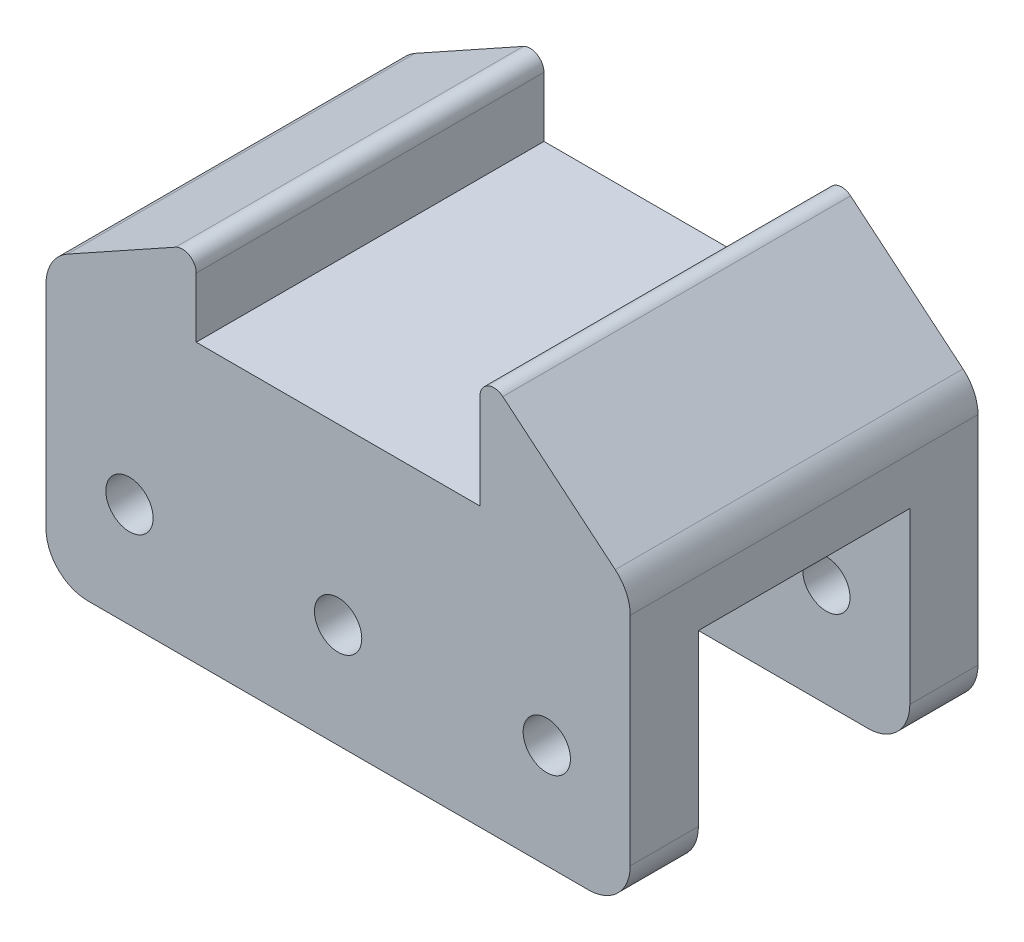
ISO-10303-21;
HEADER;
FILE_DESCRIPTION(('STEP AP214'),'2;1');
FILE_NAME('part.step','',(''),(''),'','','');
FILE_SCHEMA(('AUTOMOTIVE_DESIGN { 1 0 10303 214 1 1 1 1 }'));
ENDSEC;
DATA;
#1=APPLICATION_CONTEXT('core data for automotive mechanical design processes');
#2=APPLICATION_PROTOCOL_DEFINITION('international standard','automotive_design',2000,#1);
#3=PRODUCT_CONTEXT('',#1,'mechanical');
#4=PRODUCT('Part','Part','',(#3));
#5=PRODUCT_RELATED_PRODUCT_CATEGORY('part','',(#4));
#6=PRODUCT_DEFINITION_FORMATION('','',#4);
#7=PRODUCT_DEFINITION_CONTEXT('part definition',#1,'design');
#8=PRODUCT_DEFINITION('design','',#6,#7);
#9=PRODUCT_DEFINITION_SHAPE('','',#8);
#10=(LENGTH_UNIT() NAMED_UNIT(*) SI_UNIT(.MILLI.,.METRE.));
#11=(NAMED_UNIT(*) PLANE_ANGLE_UNIT() SI_UNIT($,.RADIAN.));
#12=(NAMED_UNIT(*) SI_UNIT($,.STERADIAN.) SOLID_ANGLE_UNIT());
#13=UNCERTAINTY_MEASURE_WITH_UNIT(LENGTH_MEASURE(1.E-05),#10,'distance_accuracy_value','');
#14=(GEOMETRIC_REPRESENTATION_CONTEXT(3) GLOBAL_UNCERTAINTY_ASSIGNED_CONTEXT((#13)) GLOBAL_UNIT_ASSIGNED_CONTEXT((#10,
#11,#12)) REPRESENTATION_CONTEXT('',''));
#15=CARTESIAN_POINT('',(0.,0.,0.));
#16=DIRECTION('',(0.,0.,1.));
#17=DIRECTION('',(1.,0.,0.));
#18=AXIS2_PLACEMENT_3D('',#15,#16,#17);
#19=CARTESIAN_POINT('',(0.,20.,0.));
#20=DIRECTION('',(0.,-1.,0.));
#21=DIRECTION('',(0.,0.,-1.));
#22=AXIS2_PLACEMENT_3D('',#19,#20,#21);
#23=PLANE('',#22);
#24=DIRECTION('',(-1.,0.,0.));
#25=VECTOR('',#24,1.);
#26=CARTESIAN_POINT('',(0.,20.,-25.));
#27=LINE('',#26,#25);
#28=CARTESIAN_POINT('',(31.2,20.,-25.));
#29=VERTEX_POINT('',#28);
#30=CARTESIAN_POINT('',(10.8,20.,-25.));
#31=VERTEX_POINT('',#30);
#32=EDGE_CURVE('E187',#29,#31,#27,.T.);
#33=ORIENTED_EDGE('',*,*,#32,.T.);
#34=DIRECTION('',(0.,0.,1.));
#35=VECTOR('',#34,1.);
#36=CARTESIAN_POINT('',(10.8,20.,-39.058449416632));
#37=LINE('',#36,#35);
#38=CARTESIAN_POINT('',(10.8,20.,0.));
#39=VERTEX_POINT('',#38);
#40=EDGE_CURVE('E198',#31,#39,#37,.T.);
#41=ORIENTED_EDGE('',*,*,#40,.T.);
#42=DIRECTION('',(1.,0.,0.));
#43=VECTOR('',#42,1.);
#44=CARTESIAN_POINT('',(0.,20.,0.));
#45=LINE('',#44,#43);
#46=CARTESIAN_POINT('',(31.2,20.,0.));
#47=VERTEX_POINT('',#46);
#48=EDGE_CURVE('E212',#39,#47,#45,.T.);
#49=ORIENTED_EDGE('',*,*,#48,.T.);
#50=DIRECTION('',(0.,0.,1.));
#51=VECTOR('',#50,1.);
#52=CARTESIAN_POINT('',(31.2,20.,-39.058449416632));
#53=LINE('',#52,#51);
#54=EDGE_CURVE('E209',#29,#47,#53,.T.);
#55=ORIENTED_EDGE('',*,*,#54,.F.);
#56=EDGE_LOOP('',(#33,#41,#49,#55));
#57=FACE_BOUND('',#56,.T.);
#58=ADVANCED_FACE('F45',(#57),#23,.F.);
#59=CARTESIAN_POINT('',(0.,0.,0.));
#60=DIRECTION('',(0.,-1.,0.));
#61=DIRECTION('',(0.,0.,-1.));
#62=AXIS2_PLACEMENT_3D('',#59,#60,#61);
#63=PLANE('',#62);
#64=DIRECTION('',(-1.,0.,0.));
#65=VECTOR('',#64,1.);
#66=CARTESIAN_POINT('',(0.,0.,-25.));
#67=LINE('',#66,#65);
#68=CARTESIAN_POINT('',(39.,0.,-25.));
#69=VERTEX_POINT('',#68);
#70=CARTESIAN_POINT('',(3.,0.,-25.));
#71=VERTEX_POINT('',#70);
#72=EDGE_CURVE('E219',#69,#71,#67,.T.);
#73=ORIENTED_EDGE('',*,*,#72,.F.);
#74=DIRECTION('',(0.,0.,-1.));
#75=VECTOR('',#74,1.);
#76=CARTESIAN_POINT('',(39.,0.,-20.1));
#77=LINE('',#76,#75);
#78=CARTESIAN_POINT('',(39.,0.,-20.1));
#79=VERTEX_POINT('',#78);
#80=EDGE_CURVE('E315',#69,#79,#77,.F.);
#81=ORIENTED_EDGE('',*,*,#80,.T.);
#82=DIRECTION('',(-1.,0.,0.));
#83=VECTOR('',#82,1.);
#84=CARTESIAN_POINT('',(42.,0.,-20.1));
#85=LINE('',#84,#83);
#86=CARTESIAN_POINT('',(3.00000000000002,0.,-20.1));
#87=VERTEX_POINT('',#86);
#88=EDGE_CURVE('E390',#79,#87,#85,.T.);
#89=ORIENTED_EDGE('',*,*,#88,.T.);
#90=DIRECTION('',(0.,0.,1.));
#91=VECTOR('',#90,1.);
#92=CARTESIAN_POINT('',(3.,0.,-25.));
#93=LINE('',#92,#91);
#94=EDGE_CURVE('E312',#87,#71,#93,.F.);
#95=ORIENTED_EDGE('',*,*,#94,.T.);
#96=EDGE_LOOP('',(#73,#81,#89,#95));
#97=FACE_BOUND('',#96,.T.);
#98=ADVANCED_FACE('F415',(#97),#63,.T.);
#99=CARTESIAN_POINT('',(0.,20.,0.));
#100=DIRECTION('',(1.,0.,0.));
#101=DIRECTION('',(0.,0.,-1.));
#102=AXIS2_PLACEMENT_3D('',#99,#100,#101);
#103=PLANE('',#102);
#104=DIRECTION('',(0.,-1.,0.));
#105=VECTOR('',#104,1.);
#106=CARTESIAN_POINT('',(0.,20.,0.));
#107=LINE('',#106,#105);
#108=CARTESIAN_POINT('',(0.,18.2347899530043,0.));
#109=VERTEX_POINT('',#108);
#110=CARTESIAN_POINT('',(0.,3.,0.));
#111=VERTEX_POINT('',#110);
#112=EDGE_CURVE('E238',#109,#111,#107,.T.);
#113=ORIENTED_EDGE('',*,*,#112,.F.);
#114=DIRECTION('',(0.,0.,1.));
#115=VECTOR('',#114,1.);
#116=CARTESIAN_POINT('',(0.,18.2347899530043,-25.));
#117=LINE('',#116,#115);
#118=CARTESIAN_POINT('',(0.,18.2347899530043,-25.));
#119=VERTEX_POINT('',#118);
#120=EDGE_CURVE('E309',#109,#119,#117,.F.);
#121=ORIENTED_EDGE('',*,*,#120,.T.);
#122=DIRECTION('',(0.,-1.,0.));
#123=VECTOR('',#122,1.);
#124=CARTESIAN_POINT('',(0.,20.,-25.));
#125=LINE('',#124,#123);
#126=CARTESIAN_POINT('',(0.,3.,-25.));
#127=VERTEX_POINT('',#126);
#128=EDGE_CURVE('E211',#119,#127,#125,.T.);
#129=ORIENTED_EDGE('',*,*,#128,.T.);
#130=DIRECTION('',(0.,0.,1.));
#131=VECTOR('',#130,1.);
#132=CARTESIAN_POINT('',(0.,3.,-20.1));
#133=LINE('',#132,#131);
#134=CARTESIAN_POINT('',(0.,3.,-20.1));
#135=VERTEX_POINT('',#134);
#136=EDGE_CURVE('E305',#127,#135,#133,.T.);
#137=ORIENTED_EDGE('',*,*,#136,.T.);
#138=DIRECTION('',(0.,-1.,0.));
#139=VECTOR('',#138,1.);
#140=CARTESIAN_POINT('',(0.,0.,-20.1));
#141=LINE('',#140,#139);
#142=CARTESIAN_POINT('',(0.,15.2,-20.1));
#143=VERTEX_POINT('',#142);
#144=EDGE_CURVE('E194',#143,#135,#141,.T.);
#145=ORIENTED_EDGE('',*,*,#144,.F.);
#146=DIRECTION('',(0.,0.,-1.));
#147=VECTOR('',#146,1.);
#148=CARTESIAN_POINT('',(0.,15.2,-20.1));
#149=LINE('',#148,#147);
#150=CARTESIAN_POINT('',(0.,15.2,-4.9));
#151=VERTEX_POINT('',#150);
#152=EDGE_CURVE('E383',#151,#143,#149,.T.);
#153=ORIENTED_EDGE('',*,*,#152,.F.);
#154=DIRECTION('',(0.,1.,0.));
#155=VECTOR('',#154,1.);
#156=CARTESIAN_POINT('',(0.,0.,-4.9));
#157=LINE('',#156,#155);
#158=CARTESIAN_POINT('',(0.,3.,-4.9));
#159=VERTEX_POINT('',#158);
#160=EDGE_CURVE('E394',#159,#151,#157,.T.);
#161=ORIENTED_EDGE('',*,*,#160,.F.);
#162=DIRECTION('',(0.,0.,1.));
#163=VECTOR('',#162,1.);
#164=CARTESIAN_POINT('',(0.,3.,0.));
#165=LINE('',#164,#163);
#166=EDGE_CURVE('E301',#159,#111,#165,.T.);
#167=ORIENTED_EDGE('',*,*,#166,.T.);
#168=EDGE_LOOP('',(#113,#121,#129,#137,#145,#153,#161,#167));
#169=FACE_BOUND('',#168,.T.);
#170=ADVANCED_FACE('F427',(#169),#103,.F.);
#171=CARTESIAN_POINT('',(0.,20.,0.));
#172=DIRECTION('',(0.,0.,-1.));
#173=DIRECTION('',(-1.,0.,0.));
#174=AXIS2_PLACEMENT_3D('',#171,#172,#173);
#175=PLANE('',#174);
#176=CARTESIAN_POINT('',(6.,7.5,0.));
#177=DIRECTION('',(0.,0.,1.));
#178=DIRECTION('',(1.,0.,0.));
#179=AXIS2_PLACEMENT_3D('',#176,#177,#178);
#180=CIRCLE('',#179,1.7);
#181=CARTESIAN_POINT('',(7.7,7.5,0.));
#182=VERTEX_POINT('',#181);
#183=EDGE_CURVE('E562',#182,#182,#180,.T.);
#184=ORIENTED_EDGE('',*,*,#183,.F.);
#185=EDGE_LOOP('',(#184));
#186=FACE_BOUND('',#185,.T.);
#187=CARTESIAN_POINT('',(21.,7.5,0.));
#188=DIRECTION('',(0.,0.,1.));
#189=DIRECTION('',(1.,0.,0.));
#190=AXIS2_PLACEMENT_3D('',#187,#188,#189);
#191=CIRCLE('',#190,1.7);
#192=CARTESIAN_POINT('',(22.7,7.5,0.));
#193=VERTEX_POINT('',#192);
#194=EDGE_CURVE('E558',#193,#193,#191,.T.);
#195=ORIENTED_EDGE('',*,*,#194,.F.);
#196=EDGE_LOOP('',(#195));
#197=FACE_BOUND('',#196,.T.);
#198=CARTESIAN_POINT('',(36.,7.5,0.));
#199=DIRECTION('',(0.,0.,1.));
#200=DIRECTION('',(1.,0.,0.));
#201=AXIS2_PLACEMENT_3D('',#198,#199,#200);
#202=CIRCLE('',#201,1.7);
#203=CARTESIAN_POINT('',(37.7,7.5,0.));
#204=VERTEX_POINT('',#203);
#205=EDGE_CURVE('E550',#204,#204,#202,.T.);
#206=ORIENTED_EDGE('',*,*,#205,.F.);
#207=EDGE_LOOP('',(#206));
#208=FACE_BOUND('',#207,.T.);
#209=DIRECTION('',(0.,1.,0.));
#210=VECTOR('',#209,1.);
#211=CARTESIAN_POINT('',(10.8,26.,0.));
#212=LINE('',#211,#210);
#213=CARTESIAN_POINT('',(10.8,24.3004855398903,0.));
#214=VERTEX_POINT('',#213);
#215=EDGE_CURVE('E201',#39,#214,#212,.T.);
#216=ORIENTED_EDGE('',*,*,#215,.T.);
#217=CARTESIAN_POINT('',(9.8,24.3004855398903,0.));
#218=DIRECTION('',(0.,0.,-1.));
#219=DIRECTION('',(-1.,0.,0.));
#220=AXIS2_PLACEMENT_3D('',#217,#218,#219);
#221=CIRCLE('',#220,1.);
#222=CARTESIAN_POINT('',(9.31435706882137,25.1746428160119,0.));
#223=VERTEX_POINT('',#222);
#224=EDGE_CURVE('E342',#214,#223,#221,.F.);
#225=ORIENTED_EDGE('',*,*,#224,.T.);
#226=DIRECTION('',(-0.874157276121538,-0.485642931178632,0.));
#227=VECTOR('',#226,1.);
#228=CARTESIAN_POINT('',(0.,20.,0.));
#229=LINE('',#228,#227);
#230=CARTESIAN_POINT('',(1.5430712064641,20.8572617813689,0.));
#231=VERTEX_POINT('',#230);
#232=EDGE_CURVE('E206',#223,#231,#229,.T.);
#233=ORIENTED_EDGE('',*,*,#232,.T.);
#234=CARTESIAN_POINT('',(3.,18.2347899530043,0.));
#235=DIRECTION('',(0.,0.,-1.));
#236=DIRECTION('',(-1.,0.,0.));
#237=AXIS2_PLACEMENT_3D('',#234,#235,#236);
#238=CIRCLE('',#237,3.);
#239=EDGE_CURVE('E291',#231,#109,#238,.F.);
#240=ORIENTED_EDGE('',*,*,#239,.T.);
#241=ORIENTED_EDGE('',*,*,#112,.T.);
#242=CARTESIAN_POINT('',(3.,3.,0.));
#243=DIRECTION('',(0.,0.,-1.));
#244=DIRECTION('',(-1.,0.,0.));
#245=AXIS2_PLACEMENT_3D('',#242,#243,#244);
#246=CIRCLE('',#245,3.);
#247=CARTESIAN_POINT('',(3.,0.,0.));
#248=VERTEX_POINT('',#247);
#249=EDGE_CURVE('E285',#111,#248,#246,.F.);
#250=ORIENTED_EDGE('',*,*,#249,.T.);
#251=DIRECTION('',(1.,0.,0.));
#252=VECTOR('',#251,1.);
#253=CARTESIAN_POINT('',(0.,0.,0.));
#254=LINE('',#253,#252);
#255=CARTESIAN_POINT('',(39.,0.,0.));
#256=VERTEX_POINT('',#255);
#257=EDGE_CURVE('E223',#248,#256,#254,.T.);
#258=ORIENTED_EDGE('',*,*,#257,.T.);
#259=CARTESIAN_POINT('',(39.,3.,0.));
#260=DIRECTION('',(0.,0.,-1.));
#261=DIRECTION('',(-1.,0.,0.));
#262=AXIS2_PLACEMENT_3D('',#259,#260,#261);
#263=CIRCLE('',#262,3.);
#264=CARTESIAN_POINT('',(42.,3.,0.));
#265=VERTEX_POINT('',#264);
#266=EDGE_CURVE('E288',#256,#265,#263,.F.);
#267=ORIENTED_EDGE('',*,*,#266,.T.);
#268=DIRECTION('',(0.,-1.,0.));
#269=VECTOR('',#268,1.);
#270=CARTESIAN_POINT('',(42.,20.,0.));
#271=LINE('',#270,#269);
#272=CARTESIAN_POINT('',(42.,18.5948751620467,0.));
#273=VERTEX_POINT('',#272);
#274=EDGE_CURVE('E234',#273,#265,#271,.T.);
#275=ORIENTED_EDGE('',*,*,#274,.F.);
#276=CARTESIAN_POINT('',(39.,18.5948751620467,0.));
#277=DIRECTION('',(0.,0.,-1.));
#278=DIRECTION('',(-1.,0.,0.));
#279=AXIS2_PLACEMENT_3D('',#276,#277,#278);
#280=CIRCLE('',#279,3.);
#281=CARTESIAN_POINT('',(40.9205531989934,20.8995390008388,0.));
#282=VERTEX_POINT('',#281);
#283=EDGE_CURVE('E294',#273,#282,#280,.F.);
#284=ORIENTED_EDGE('',*,*,#283,.T.);
#285=DIRECTION('',(-0.768221279597376,0.64018439966448,0.));
#286=VECTOR('',#285,1.);
#287=CARTESIAN_POINT('',(31.2,29.,0.));
#288=LINE('',#287,#286);
#289=CARTESIAN_POINT('',(32.8401843996645,27.6331796669463,0.));
#290=VERTEX_POINT('',#289);
#291=EDGE_CURVE('E358',#282,#290,#288,.T.);
#292=ORIENTED_EDGE('',*,*,#291,.T.);
#293=CARTESIAN_POINT('',(32.2,26.8649583873489,0.));
#294=DIRECTION('',(0.,0.,-1.));
#295=DIRECTION('',(-1.,0.,0.));
#296=AXIS2_PLACEMENT_3D('',#293,#294,#295);
#297=CIRCLE('',#296,1.);
#298=CARTESIAN_POINT('',(31.2,26.8649583873489,0.));
#299=VERTEX_POINT('',#298);
#300=EDGE_CURVE('E339',#290,#299,#297,.F.);
#301=ORIENTED_EDGE('',*,*,#300,.T.);
#302=DIRECTION('',(0.,-1.,0.));
#303=VECTOR('',#302,1.);
#304=CARTESIAN_POINT('',(31.2,20.,0.));
#305=LINE('',#304,#303);
#306=EDGE_CURVE('E367',#299,#47,#305,.T.);
#307=ORIENTED_EDGE('',*,*,#306,.T.);
#308=ORIENTED_EDGE('',*,*,#48,.F.);
#309=EDGE_LOOP('',(#216,#225,#233,#240,#241,#250,#258,#267,#275,#284,#292,#301,#307,#308));
#310=FACE_BOUND('',#309,.T.);
#311=ADVANCED_FACE('F363',(#186,#197,#208,#310),#175,.F.);
#312=CARTESIAN_POINT('',(42.,20.,0.));
#313=DIRECTION('',(-1.,0.,0.));
#314=DIRECTION('',(0.,0.,1.));
#315=AXIS2_PLACEMENT_3D('',#312,#313,#314);
#316=PLANE('',#315);
#317=DIRECTION('',(0.,-1.,0.));
#318=VECTOR('',#317,1.);
#319=CARTESIAN_POINT('',(42.,20.,-25.));
#320=LINE('',#319,#318);
#321=CARTESIAN_POINT('',(42.,18.5948751620467,-25.));
#322=VERTEX_POINT('',#321);
#323=CARTESIAN_POINT('',(42.,3.,-25.));
#324=VERTEX_POINT('',#323);
#325=EDGE_CURVE('E217',#322,#324,#320,.T.);
#326=ORIENTED_EDGE('',*,*,#325,.F.);
#327=DIRECTION('',(0.,0.,-1.));
#328=VECTOR('',#327,1.);
#329=CARTESIAN_POINT('',(42.,18.5948751620467,0.));
#330=LINE('',#329,#328);
#331=EDGE_CURVE('E282',#322,#273,#330,.F.);
#332=ORIENTED_EDGE('',*,*,#331,.T.);
#333=ORIENTED_EDGE('',*,*,#274,.T.);
#334=DIRECTION('',(0.,0.,-1.));
#335=VECTOR('',#334,1.);
#336=CARTESIAN_POINT('',(42.,3.,-4.9));
#337=LINE('',#336,#335);
#338=CARTESIAN_POINT('',(42.,3.,-4.9));
#339=VERTEX_POINT('',#338);
#340=EDGE_CURVE('E274',#265,#339,#337,.T.);
#341=ORIENTED_EDGE('',*,*,#340,.T.);
#342=DIRECTION('',(0.,1.,0.));
#343=VECTOR('',#342,1.);
#344=CARTESIAN_POINT('',(42.,0.,-4.9));
#345=LINE('',#344,#343);
#346=CARTESIAN_POINT('',(42.,15.2,-4.9));
#347=VERTEX_POINT('',#346);
#348=EDGE_CURVE('E382',#339,#347,#345,.T.);
#349=ORIENTED_EDGE('',*,*,#348,.T.);
#350=DIRECTION('',(0.,0.,-1.));
#351=VECTOR('',#350,1.);
#352=CARTESIAN_POINT('',(42.,15.2,-20.1));
#353=LINE('',#352,#351);
#354=CARTESIAN_POINT('',(42.,15.2,-20.1));
#355=VERTEX_POINT('',#354);
#356=EDGE_CURVE('E386',#347,#355,#353,.T.);
#357=ORIENTED_EDGE('',*,*,#356,.T.);
#358=DIRECTION('',(0.,-1.,0.));
#359=VECTOR('',#358,1.);
#360=CARTESIAN_POINT('',(42.,0.,-20.1));
#361=LINE('',#360,#359);
#362=CARTESIAN_POINT('',(42.,3.,-20.1));
#363=VERTEX_POINT('',#362);
#364=EDGE_CURVE('E378',#355,#363,#361,.T.);
#365=ORIENTED_EDGE('',*,*,#364,.T.);
#366=DIRECTION('',(0.,0.,-1.));
#367=VECTOR('',#366,1.);
#368=CARTESIAN_POINT('',(42.,3.,-25.));
#369=LINE('',#368,#367);
#370=EDGE_CURVE('E278',#363,#324,#369,.T.);
#371=ORIENTED_EDGE('',*,*,#370,.T.);
#372=EDGE_LOOP('',(#326,#332,#333,#341,#349,#357,#365,#371));
#373=FACE_BOUND('',#372,.T.);
#374=ADVANCED_FACE('F473',(#373),#316,.F.);
#375=CARTESIAN_POINT('',(0.,20.,-25.));
#376=DIRECTION('',(0.,0.,1.));
#377=DIRECTION('',(1.,0.,0.));
#378=AXIS2_PLACEMENT_3D('',#375,#376,#377);
#379=PLANE('',#378);
#380=CARTESIAN_POINT('',(6.,7.5,-25.));
#381=DIRECTION('',(0.,0.,1.));
#382=DIRECTION('',(1.,0.,0.));
#383=AXIS2_PLACEMENT_3D('',#380,#381,#382);
#384=CIRCLE('',#383,1.7);
#385=CARTESIAN_POINT('',(7.7,7.5,-25.));
#386=VERTEX_POINT('',#385);
#387=EDGE_CURVE('E248',#386,#386,#384,.T.);
#388=ORIENTED_EDGE('',*,*,#387,.T.);
#389=EDGE_LOOP('',(#388));
#390=FACE_BOUND('',#389,.T.);
#391=CARTESIAN_POINT('',(21.,7.5,-25.));
#392=DIRECTION('',(0.,0.,1.));
#393=DIRECTION('',(1.,0.,0.));
#394=AXIS2_PLACEMENT_3D('',#391,#392,#393);
#395=CIRCLE('',#394,1.7);
#396=CARTESIAN_POINT('',(22.7,7.5,-25.));
#397=VERTEX_POINT('',#396);
#398=EDGE_CURVE('E554',#397,#397,#395,.T.);
#399=ORIENTED_EDGE('',*,*,#398,.T.);
#400=EDGE_LOOP('',(#399));
#401=FACE_BOUND('',#400,.T.);
#402=CARTESIAN_POINT('',(36.,7.5,-25.));
#403=DIRECTION('',(0.,0.,1.));
#404=DIRECTION('',(1.,0.,0.));
#405=AXIS2_PLACEMENT_3D('',#402,#403,#404);
#406=CIRCLE('',#405,1.7);
#407=CARTESIAN_POINT('',(37.7,7.5,-25.));
#408=VERTEX_POINT('',#407);
#409=EDGE_CURVE('E544',#408,#408,#406,.T.);
#410=ORIENTED_EDGE('',*,*,#409,.T.);
#411=EDGE_LOOP('',(#410));
#412=FACE_BOUND('',#411,.T.);
#413=DIRECTION('',(0.874157276121538,0.485642931178632,0.));
#414=VECTOR('',#413,1.);
#415=CARTESIAN_POINT('',(0.,20.,-25.));
#416=LINE('',#415,#414);
#417=CARTESIAN_POINT('',(1.5430712064641,20.8572617813689,-25.));
#418=VERTEX_POINT('',#417);
#419=CARTESIAN_POINT('',(9.31435706882137,25.1746428160119,-25.));
#420=VERTEX_POINT('',#419);
#421=EDGE_CURVE('E195',#418,#420,#416,.T.);
#422=ORIENTED_EDGE('',*,*,#421,.T.);
#423=CARTESIAN_POINT('',(9.8,24.3004855398903,-25.));
#424=DIRECTION('',(0.,0.,1.));
#425=DIRECTION('',(1.,0.,0.));
#426=AXIS2_PLACEMENT_3D('',#423,#424,#425);
#427=CIRCLE('',#426,1.);
#428=CARTESIAN_POINT('',(10.8,24.3004855398903,-25.));
#429=VERTEX_POINT('',#428);
#430=EDGE_CURVE('E189',#420,#429,#427,.F.);
#431=ORIENTED_EDGE('',*,*,#430,.T.);
#432=DIRECTION('',(0.,-1.,0.));
#433=VECTOR('',#432,1.);
#434=CARTESIAN_POINT('',(10.8,26.,-25.));
#435=LINE('',#434,#433);
#436=EDGE_CURVE('E182',#429,#31,#435,.T.);
#437=ORIENTED_EDGE('',*,*,#436,.T.);
#438=ORIENTED_EDGE('',*,*,#32,.F.);
#439=DIRECTION('',(0.,1.,0.));
#440=VECTOR('',#439,1.);
#441=CARTESIAN_POINT('',(31.2,20.,-25.));
#442=LINE('',#441,#440);
#443=CARTESIAN_POINT('',(31.2,26.8649583873489,-25.));
#444=VERTEX_POINT('',#443);
#445=EDGE_CURVE('E375',#29,#444,#442,.T.);
#446=ORIENTED_EDGE('',*,*,#445,.T.);
#447=CARTESIAN_POINT('',(32.2,26.8649583873489,-25.));
#448=DIRECTION('',(0.,0.,1.));
#449=DIRECTION('',(1.,0.,0.));
#450=AXIS2_PLACEMENT_3D('',#447,#448,#449);
#451=CIRCLE('',#450,1.);
#452=CARTESIAN_POINT('',(32.8401843996645,27.6331796669463,-25.));
#453=VERTEX_POINT('',#452);
#454=EDGE_CURVE('E66',#444,#453,#451,.F.);
#455=ORIENTED_EDGE('',*,*,#454,.T.);
#456=DIRECTION('',(0.768221279597376,-0.64018439966448,0.));
#457=VECTOR('',#456,1.);
#458=CARTESIAN_POINT('',(31.2,29.,-25.));
#459=LINE('',#458,#457);
#460=CARTESIAN_POINT('',(40.9205531989934,20.8995390008388,-25.));
#461=VERTEX_POINT('',#460);
#462=EDGE_CURVE('E360',#453,#461,#459,.T.);
#463=ORIENTED_EDGE('',*,*,#462,.T.);
#464=CARTESIAN_POINT('',(39.,18.5948751620467,-25.));
#465=DIRECTION('',(0.,0.,1.));
#466=DIRECTION('',(1.,0.,0.));
#467=AXIS2_PLACEMENT_3D('',#464,#465,#466);
#468=CIRCLE('',#467,3.);
#469=EDGE_CURVE('E271',#461,#322,#468,.F.);
#470=ORIENTED_EDGE('',*,*,#469,.T.);
#471=ORIENTED_EDGE('',*,*,#325,.T.);
#472=CARTESIAN_POINT('',(39.,3.,-25.));
#473=DIRECTION('',(0.,0.,1.));
#474=DIRECTION('',(1.,0.,0.));
#475=AXIS2_PLACEMENT_3D('',#472,#473,#474);
#476=CIRCLE('',#475,3.);
#477=EDGE_CURVE('E265',#324,#69,#476,.F.);
#478=ORIENTED_EDGE('',*,*,#477,.T.);
#479=ORIENTED_EDGE('',*,*,#72,.T.);
#480=CARTESIAN_POINT('',(3.,3.,-25.));
#481=DIRECTION('',(0.,0.,1.));
#482=DIRECTION('',(1.,0.,0.));
#483=AXIS2_PLACEMENT_3D('',#480,#481,#482);
#484=CIRCLE('',#483,3.);
#485=EDGE_CURVE('E262',#71,#127,#484,.F.);
#486=ORIENTED_EDGE('',*,*,#485,.T.);
#487=ORIENTED_EDGE('',*,*,#128,.F.);
#488=CARTESIAN_POINT('',(3.,18.2347899530043,-25.));
#489=DIRECTION('',(0.,0.,1.));
#490=DIRECTION('',(1.,0.,0.));
#491=AXIS2_PLACEMENT_3D('',#488,#489,#490);
#492=CIRCLE('',#491,3.);
#493=EDGE_CURVE('E268',#119,#418,#492,.F.);
#494=ORIENTED_EDGE('',*,*,#493,.T.);
#495=EDGE_LOOP('',(#422,#431,#437,#438,#446,#455,#463,#470,#471,#478,#479,#486,#487,#494));
#496=FACE_BOUND('',#495,.T.);
#497=ADVANCED_FACE('F185',(#390,#401,#412,#496),#379,.F.);
#498=DIRECTION('',(-1.,0.,0.));
#499=VECTOR('',#498,1.);
#500=CARTESIAN_POINT('',(42.,0.,-4.9));
#501=LINE('',#500,#499);
#502=CARTESIAN_POINT('',(39.,0.,-4.9));
#503=VERTEX_POINT('',#502);
#504=CARTESIAN_POINT('',(3.00000000000002,0.,-4.9));
#505=VERTEX_POINT('',#504);
#506=EDGE_CURVE('E406',#503,#505,#501,.T.);
#507=ORIENTED_EDGE('',*,*,#506,.F.);
#508=DIRECTION('',(0.,0.,-1.));
#509=VECTOR('',#508,1.);
#510=CARTESIAN_POINT('',(39.,0.,0.));
#511=LINE('',#510,#509);
#512=EDGE_CURVE('E333',#503,#256,#511,.F.);
#513=ORIENTED_EDGE('',*,*,#512,.T.);
#514=ORIENTED_EDGE('',*,*,#257,.F.);
#515=DIRECTION('',(0.,0.,1.));
#516=VECTOR('',#515,1.);
#517=CARTESIAN_POINT('',(3.,0.,-4.9));
#518=LINE('',#517,#516);
#519=EDGE_CURVE('E330',#248,#505,#518,.F.);
#520=ORIENTED_EDGE('',*,*,#519,.T.);
#521=EDGE_LOOP('',(#507,#513,#514,#520));
#522=FACE_BOUND('',#521,.T.);
#523=ADVANCED_FACE('F464',(#522),#63,.T.);
#524=CARTESIAN_POINT('',(42.,0.,-20.1));
#525=DIRECTION('',(0.,0.,-1.));
#526=DIRECTION('',(-1.,0.,0.));
#527=AXIS2_PLACEMENT_3D('',#524,#525,#526);
#528=PLANE('',#527);
#529=CARTESIAN_POINT('',(6.,7.5,-20.1));
#530=DIRECTION('',(0.,0.,-1.));
#531=DIRECTION('',(-1.,0.,0.));
#532=AXIS2_PLACEMENT_3D('',#529,#530,#531);
#533=CIRCLE('',#532,1.7);
#534=CARTESIAN_POINT('',(4.3,7.5,-20.1));
#535=VERTEX_POINT('',#534);
#536=EDGE_CURVE('E258',#535,#535,#533,.T.);
#537=ORIENTED_EDGE('',*,*,#536,.T.);
#538=EDGE_LOOP('',(#537));
#539=FACE_BOUND('',#538,.T.);
#540=CARTESIAN_POINT('',(21.,7.5,-20.1));
#541=DIRECTION('',(0.,0.,-1.));
#542=DIRECTION('',(-1.,0.,0.));
#543=AXIS2_PLACEMENT_3D('',#540,#541,#542);
#544=CIRCLE('',#543,1.7);
#545=CARTESIAN_POINT('',(19.3,7.5,-20.1));
#546=VERTEX_POINT('',#545);
#547=EDGE_CURVE('E253',#546,#546,#544,.T.);
#548=ORIENTED_EDGE('',*,*,#547,.T.);
#549=EDGE_LOOP('',(#548));
#550=FACE_BOUND('',#549,.T.);
#551=CARTESIAN_POINT('',(36.,7.5,-20.1));
#552=DIRECTION('',(0.,0.,-1.));
#553=DIRECTION('',(-1.,0.,0.));
#554=AXIS2_PLACEMENT_3D('',#551,#552,#553);
#555=CIRCLE('',#554,1.7);
#556=CARTESIAN_POINT('',(34.3,7.5,-20.1));
#557=VERTEX_POINT('',#556);
#558=EDGE_CURVE('E247',#557,#557,#555,.T.);
#559=ORIENTED_EDGE('',*,*,#558,.T.);
#560=EDGE_LOOP('',(#559));
#561=FACE_BOUND('',#560,.T.);
#562=ORIENTED_EDGE('',*,*,#88,.F.);
#563=CARTESIAN_POINT('',(39.,3.,-20.1));
#564=DIRECTION('',(0.,0.,-1.));
#565=DIRECTION('',(-1.,0.,0.));
#566=AXIS2_PLACEMENT_3D('',#563,#564,#565);
#567=CIRCLE('',#566,3.);
#568=EDGE_CURVE('E321',#79,#363,#567,.F.);
#569=ORIENTED_EDGE('',*,*,#568,.T.);
#570=ORIENTED_EDGE('',*,*,#364,.F.);
#571=DIRECTION('',(-1.,0.,0.));
#572=VECTOR('',#571,1.);
#573=CARTESIAN_POINT('',(42.,15.2,-20.1));
#574=LINE('',#573,#572);
#575=EDGE_CURVE('E227',#355,#143,#574,.T.);
#576=ORIENTED_EDGE('',*,*,#575,.T.);
#577=ORIENTED_EDGE('',*,*,#144,.T.);
#578=CARTESIAN_POINT('',(3.,3.,-20.1));
#579=DIRECTION('',(0.,0.,-1.));
#580=DIRECTION('',(-1.,0.,0.));
#581=AXIS2_PLACEMENT_3D('',#578,#579,#580);
#582=CIRCLE('',#581,3.);
#583=EDGE_CURVE('E318',#135,#87,#582,.F.);
#584=ORIENTED_EDGE('',*,*,#583,.T.);
#585=EDGE_LOOP('',(#562,#569,#570,#576,#577,#584));
#586=FACE_BOUND('',#585,.T.);
#587=ADVANCED_FACE('F466',(#539,#550,#561,#586),#528,.F.);
#588=CARTESIAN_POINT('',(42.,15.2,-20.1));
#589=DIRECTION('',(0.,1.,0.));
#590=DIRECTION('',(0.,0.,1.));
#591=AXIS2_PLACEMENT_3D('',#588,#589,#590);
#592=PLANE('',#591);
#593=ORIENTED_EDGE('',*,*,#152,.T.);
#594=ORIENTED_EDGE('',*,*,#575,.F.);
#595=ORIENTED_EDGE('',*,*,#356,.F.);
#596=DIRECTION('',(-1.,0.,0.));
#597=VECTOR('',#596,1.);
#598=CARTESIAN_POINT('',(42.,15.2,-4.9));
#599=LINE('',#598,#597);
#600=EDGE_CURVE('E402',#347,#151,#599,.T.);
#601=ORIENTED_EDGE('',*,*,#600,.T.);
#602=EDGE_LOOP('',(#593,#594,#595,#601));
#603=FACE_BOUND('',#602,.T.);
#604=ADVANCED_FACE('F515',(#603),#592,.F.);
#605=CARTESIAN_POINT('',(42.,0.,-4.9));
#606=DIRECTION('',(0.,0.,1.));
#607=DIRECTION('',(0.,-1.,0.));
#608=AXIS2_PLACEMENT_3D('',#605,#606,#607);
#609=PLANE('',#608);
#610=CARTESIAN_POINT('',(6.,7.5,-4.9));
#611=DIRECTION('',(0.,0.,1.));
#612=DIRECTION('',(0.,-1.,0.));
#613=AXIS2_PLACEMENT_3D('',#610,#611,#612);
#614=CIRCLE('',#613,1.7);
#615=CARTESIAN_POINT('',(6.,5.8,-4.9));
#616=VERTEX_POINT('',#615);
#617=EDGE_CURVE('E254',#616,#616,#614,.T.);
#618=ORIENTED_EDGE('',*,*,#617,.T.);
#619=EDGE_LOOP('',(#618));
#620=FACE_BOUND('',#619,.T.);
#621=CARTESIAN_POINT('',(21.,7.5,-4.9));
#622=DIRECTION('',(0.,0.,1.));
#623=DIRECTION('',(0.,-1.,0.));
#624=AXIS2_PLACEMENT_3D('',#621,#622,#623);
#625=CIRCLE('',#624,1.7);
#626=CARTESIAN_POINT('',(21.,5.8,-4.9));
#627=VERTEX_POINT('',#626);
#628=EDGE_CURVE('E249',#627,#627,#625,.T.);
#629=ORIENTED_EDGE('',*,*,#628,.T.);
#630=EDGE_LOOP('',(#629));
#631=FACE_BOUND('',#630,.T.);
#632=CARTESIAN_POINT('',(36.,7.5,-4.9));
#633=DIRECTION('',(0.,0.,1.));
#634=DIRECTION('',(0.,-1.,0.));
#635=AXIS2_PLACEMENT_3D('',#632,#633,#634);
#636=CIRCLE('',#635,1.7);
#637=CARTESIAN_POINT('',(36.,5.8,-4.9));
#638=VERTEX_POINT('',#637);
#639=EDGE_CURVE('E243',#638,#638,#636,.T.);
#640=ORIENTED_EDGE('',*,*,#639,.T.);
#641=EDGE_LOOP('',(#640));
#642=FACE_BOUND('',#641,.T.);
#643=ORIENTED_EDGE('',*,*,#348,.F.);
#644=CARTESIAN_POINT('',(39.,3.,-4.9));
#645=DIRECTION('',(0.,0.,1.));
#646=DIRECTION('',(0.,-1.,0.));
#647=AXIS2_PLACEMENT_3D('',#644,#645,#646);
#648=CIRCLE('',#647,3.);
#649=EDGE_CURVE('E327',#339,#503,#648,.F.);
#650=ORIENTED_EDGE('',*,*,#649,.T.);
#651=ORIENTED_EDGE('',*,*,#506,.T.);
#652=CARTESIAN_POINT('',(3.,3.,-4.9));
#653=DIRECTION('',(0.,0.,1.));
#654=DIRECTION('',(0.,-1.,0.));
#655=AXIS2_PLACEMENT_3D('',#652,#653,#654);
#656=CIRCLE('',#655,3.);
#657=EDGE_CURVE('E324',#505,#159,#656,.F.);
#658=ORIENTED_EDGE('',*,*,#657,.T.);
#659=ORIENTED_EDGE('',*,*,#160,.T.);
#660=ORIENTED_EDGE('',*,*,#600,.F.);
#661=EDGE_LOOP('',(#643,#650,#651,#658,#659,#660));
#662=FACE_BOUND('',#661,.T.);
#663=ADVANCED_FACE('F510',(#620,#631,#642,#662),#609,.F.);
#664=CARTESIAN_POINT('',(31.2,20.,-39.058449416632));
#665=DIRECTION('',(-1.,0.,0.));
#666=DIRECTION('',(0.,0.,1.));
#667=AXIS2_PLACEMENT_3D('',#664,#665,#666);
#668=PLANE('',#667);
#669=ORIENTED_EDGE('',*,*,#306,.F.);
#670=DIRECTION('',(0.,0.,1.));
#671=VECTOR('',#670,1.);
#672=CARTESIAN_POINT('',(31.2,26.8649583873489,-39.058449416632));
#673=LINE('',#672,#671);
#674=EDGE_CURVE('E11',#299,#444,#673,.F.);
#675=ORIENTED_EDGE('',*,*,#674,.T.);
#676=ORIENTED_EDGE('',*,*,#445,.F.);
#677=ORIENTED_EDGE('',*,*,#54,.T.);
#678=EDGE_LOOP('',(#669,#675,#676,#677));
#679=FACE_BOUND('',#678,.T.);
#680=ADVANCED_FACE('F448',(#679),#668,.T.);
#681=CARTESIAN_POINT('',(31.2,29.,-39.058449416632));
#682=DIRECTION('',(0.64018439966448,0.768221279597376,0.));
#683=DIRECTION('',(-0.768221279597376,0.64018439966448,0.));
#684=AXIS2_PLACEMENT_3D('',#681,#682,#683);
#685=PLANE('',#684);
#686=ORIENTED_EDGE('',*,*,#462,.F.);
#687=DIRECTION('',(0.,0.,1.));
#688=VECTOR('',#687,1.);
#689=CARTESIAN_POINT('',(32.8401843996645,27.6331796669463,-39.058449416632));
#690=LINE('',#689,#688);
#691=EDGE_CURVE('E54',#453,#290,#690,.T.);
#692=ORIENTED_EDGE('',*,*,#691,.T.);
#693=ORIENTED_EDGE('',*,*,#291,.F.);
#694=DIRECTION('',(0.,0.,-1.));
#695=VECTOR('',#694,1.);
#696=CARTESIAN_POINT('',(40.9205531989934,20.8995390008388,-25.));
#697=LINE('',#696,#695);
#698=EDGE_CURVE('E242',#282,#461,#697,.T.);
#699=ORIENTED_EDGE('',*,*,#698,.T.);
#700=EDGE_LOOP('',(#686,#692,#693,#699));
#701=FACE_BOUND('',#700,.T.);
#702=ADVANCED_FACE('F357',(#701),#685,.T.);
#703=CARTESIAN_POINT('',(0.,20.,-39.058449416632));
#704=DIRECTION('',(-0.485642931178632,0.874157276121538,0.));
#705=DIRECTION('',(-0.874157276121538,-0.485642931178632,0.));
#706=AXIS2_PLACEMENT_3D('',#703,#704,#705);
#707=PLANE('',#706);
#708=ORIENTED_EDGE('',*,*,#232,.F.);
#709=DIRECTION('',(0.,0.,1.));
#710=VECTOR('',#709,1.);
#711=CARTESIAN_POINT('',(9.31435706882137,25.1746428160119,-39.058449416632));
#712=LINE('',#711,#710);
#713=EDGE_CURVE('E345',#223,#420,#712,.F.);
#714=ORIENTED_EDGE('',*,*,#713,.T.);
#715=ORIENTED_EDGE('',*,*,#421,.F.);
#716=DIRECTION('',(0.,0.,1.));
#717=VECTOR('',#716,1.);
#718=CARTESIAN_POINT('',(1.5430712064641,20.8572617813689,0.));
#719=LINE('',#718,#717);
#720=EDGE_CURVE('E297',#418,#231,#719,.T.);
#721=ORIENTED_EDGE('',*,*,#720,.T.);
#722=EDGE_LOOP('',(#708,#714,#715,#721));
#723=FACE_BOUND('',#722,.T.);
#724=ADVANCED_FACE('F437',(#723),#707,.T.);
#725=CARTESIAN_POINT('',(10.8,26.,-39.058449416632));
#726=DIRECTION('',(1.,0.,0.));
#727=DIRECTION('',(0.,0.,-1.));
#728=AXIS2_PLACEMENT_3D('',#725,#726,#727);
#729=PLANE('',#728);
#730=ORIENTED_EDGE('',*,*,#436,.F.);
#731=DIRECTION('',(0.,0.,1.));
#732=VECTOR('',#731,1.);
#733=CARTESIAN_POINT('',(10.8,24.3004855398903,-39.058449416632));
#734=LINE('',#733,#732);
#735=EDGE_CURVE('E336',#429,#214,#734,.T.);
#736=ORIENTED_EDGE('',*,*,#735,.T.);
#737=ORIENTED_EDGE('',*,*,#215,.F.);
#738=ORIENTED_EDGE('',*,*,#40,.F.);
#739=EDGE_LOOP('',(#730,#736,#737,#738));
#740=FACE_BOUND('',#739,.T.);
#741=ADVANCED_FACE('F199',(#740),#729,.T.);
#742=CARTESIAN_POINT('',(36.,7.5,-25.));
#743=DIRECTION('',(0.,0.,1.));
#744=DIRECTION('',(1.,0.,0.));
#745=AXIS2_PLACEMENT_3D('',#742,#743,#744);
#746=CYLINDRICAL_SURFACE('',#745,1.7);
#747=ORIENTED_EDGE('',*,*,#205,.T.);
#748=EDGE_LOOP('',(#747));
#749=FACE_BOUND('',#748,.T.);
#750=ORIENTED_EDGE('',*,*,#639,.F.);
#751=EDGE_LOOP('',(#750));
#752=FACE_BOUND('',#751,.T.);
#753=ADVANCED_FACE('F591',(#749,#752),#746,.F.);
#754=CARTESIAN_POINT('',(21.,7.5,-25.));
#755=DIRECTION('',(0.,0.,1.));
#756=DIRECTION('',(1.,0.,0.));
#757=AXIS2_PLACEMENT_3D('',#754,#755,#756);
#758=CYLINDRICAL_SURFACE('',#757,1.7);
#759=ORIENTED_EDGE('',*,*,#194,.T.);
#760=EDGE_LOOP('',(#759));
#761=FACE_BOUND('',#760,.T.);
#762=ORIENTED_EDGE('',*,*,#628,.F.);
#763=EDGE_LOOP('',(#762));
#764=FACE_BOUND('',#763,.T.);
#765=ADVANCED_FACE('F582',(#761,#764),#758,.F.);
#766=CARTESIAN_POINT('',(6.,7.5,-25.));
#767=DIRECTION('',(0.,0.,1.));
#768=DIRECTION('',(1.,0.,0.));
#769=AXIS2_PLACEMENT_3D('',#766,#767,#768);
#770=CYLINDRICAL_SURFACE('',#769,1.7);
#771=ORIENTED_EDGE('',*,*,#183,.T.);
#772=EDGE_LOOP('',(#771));
#773=FACE_BOUND('',#772,.T.);
#774=ORIENTED_EDGE('',*,*,#617,.F.);
#775=EDGE_LOOP('',(#774));
#776=FACE_BOUND('',#775,.T.);
#777=ADVANCED_FACE('F575',(#773,#776),#770,.F.);
#778=ORIENTED_EDGE('',*,*,#409,.F.);
#779=EDGE_LOOP('',(#778));
#780=FACE_BOUND('',#779,.T.);
#781=ORIENTED_EDGE('',*,*,#558,.F.);
#782=EDGE_LOOP('',(#781));
#783=FACE_BOUND('',#782,.T.);
#784=ADVANCED_FACE('F579',(#780,#783),#746,.F.);
#785=ORIENTED_EDGE('',*,*,#398,.F.);
#786=EDGE_LOOP('',(#785));
#787=FACE_BOUND('',#786,.T.);
#788=ORIENTED_EDGE('',*,*,#547,.F.);
#789=EDGE_LOOP('',(#788));
#790=FACE_BOUND('',#789,.T.);
#791=ADVANCED_FACE('F573',(#787,#790),#758,.F.);
#792=ORIENTED_EDGE('',*,*,#387,.F.);
#793=EDGE_LOOP('',(#792));
#794=FACE_BOUND('',#793,.T.);
#795=ORIENTED_EDGE('',*,*,#536,.F.);
#796=EDGE_LOOP('',(#795));
#797=FACE_BOUND('',#796,.T.);
#798=ADVANCED_FACE('F486',(#794,#797),#770,.F.);
#799=CARTESIAN_POINT('',(39.,18.5948751620467,-39.058449416632));
#800=DIRECTION('',(0.,0.,1.));
#801=DIRECTION('',(1.,0.,0.));
#802=AXIS2_PLACEMENT_3D('',#799,#800,#801);
#803=CYLINDRICAL_SURFACE('',#802,3.);
#804=ORIENTED_EDGE('',*,*,#283,.F.);
#805=ORIENTED_EDGE('',*,*,#331,.F.);
#806=ORIENTED_EDGE('',*,*,#469,.F.);
#807=ORIENTED_EDGE('',*,*,#698,.F.);
#808=EDGE_LOOP('',(#804,#805,#806,#807));
#809=FACE_BOUND('',#808,.T.);
#810=ADVANCED_FACE('F483',(#809),#803,.T.);
#811=CARTESIAN_POINT('',(3.,18.2347899530043,-39.058449416632));
#812=DIRECTION('',(0.,0.,-1.));
#813=DIRECTION('',(-1.,0.,0.));
#814=AXIS2_PLACEMENT_3D('',#811,#812,#813);
#815=CYLINDRICAL_SURFACE('',#814,3.);
#816=ORIENTED_EDGE('',*,*,#493,.F.);
#817=ORIENTED_EDGE('',*,*,#120,.F.);
#818=ORIENTED_EDGE('',*,*,#239,.F.);
#819=ORIENTED_EDGE('',*,*,#720,.F.);
#820=EDGE_LOOP('',(#816,#817,#818,#819));
#821=FACE_BOUND('',#820,.T.);
#822=ADVANCED_FACE('F432',(#821),#815,.T.);
#823=CARTESIAN_POINT('',(39.,3.,0.));
#824=DIRECTION('',(0.,0.,1.));
#825=DIRECTION('',(1.,0.,0.));
#826=AXIS2_PLACEMENT_3D('',#823,#824,#825);
#827=CYLINDRICAL_SURFACE('',#826,3.);
#828=ORIENTED_EDGE('',*,*,#568,.F.);
#829=ORIENTED_EDGE('',*,*,#80,.F.);
#830=ORIENTED_EDGE('',*,*,#477,.F.);
#831=ORIENTED_EDGE('',*,*,#370,.F.);
#832=EDGE_LOOP('',(#828,#829,#830,#831));
#833=FACE_BOUND('',#832,.T.);
#834=ADVANCED_FACE('F490',(#833),#827,.T.);
#835=CARTESIAN_POINT('',(39.,3.,0.));
#836=DIRECTION('',(0.,0.,1.));
#837=DIRECTION('',(1.,0.,0.));
#838=AXIS2_PLACEMENT_3D('',#835,#836,#837);
#839=CYLINDRICAL_SURFACE('',#838,3.);
#840=ORIENTED_EDGE('',*,*,#266,.F.);
#841=ORIENTED_EDGE('',*,*,#512,.F.);
#842=ORIENTED_EDGE('',*,*,#649,.F.);
#843=ORIENTED_EDGE('',*,*,#340,.F.);
#844=EDGE_LOOP('',(#840,#841,#842,#843));
#845=FACE_BOUND('',#844,.T.);
#846=ADVANCED_FACE('F493',(#845),#839,.T.);
#847=CARTESIAN_POINT('',(3.,3.,0.));
#848=DIRECTION('',(0.,0.,-1.));
#849=DIRECTION('',(-1.,0.,0.));
#850=AXIS2_PLACEMENT_3D('',#847,#848,#849);
#851=CYLINDRICAL_SURFACE('',#850,3.);
#852=ORIENTED_EDGE('',*,*,#485,.F.);
#853=ORIENTED_EDGE('',*,*,#94,.F.);
#854=ORIENTED_EDGE('',*,*,#583,.F.);
#855=ORIENTED_EDGE('',*,*,#136,.F.);
#856=EDGE_LOOP('',(#852,#853,#854,#855));
#857=FACE_BOUND('',#856,.T.);
#858=ADVANCED_FACE('F421',(#857),#851,.T.);
#859=CARTESIAN_POINT('',(3.,3.,0.));
#860=DIRECTION('',(0.,0.,-1.));
#861=DIRECTION('',(-1.,0.,0.));
#862=AXIS2_PLACEMENT_3D('',#859,#860,#861);
#863=CYLINDRICAL_SURFACE('',#862,3.);
#864=ORIENTED_EDGE('',*,*,#657,.F.);
#865=ORIENTED_EDGE('',*,*,#519,.F.);
#866=ORIENTED_EDGE('',*,*,#249,.F.);
#867=ORIENTED_EDGE('',*,*,#166,.F.);
#868=EDGE_LOOP('',(#864,#865,#866,#867));
#869=FACE_BOUND('',#868,.T.);
#870=ADVANCED_FACE('F454',(#869),#863,.T.);
#871=CARTESIAN_POINT('',(9.8,24.3004855398903,-39.058449416632));
#872=DIRECTION('',(0.,0.,1.));
#873=DIRECTION('',(1.,0.,0.));
#874=AXIS2_PLACEMENT_3D('',#871,#872,#873);
#875=CYLINDRICAL_SURFACE('',#874,1.);
#876=ORIENTED_EDGE('',*,*,#430,.F.);
#877=ORIENTED_EDGE('',*,*,#713,.F.);
#878=ORIENTED_EDGE('',*,*,#224,.F.);
#879=ORIENTED_EDGE('',*,*,#735,.F.);
#880=EDGE_LOOP('',(#876,#877,#878,#879));
#881=FACE_BOUND('',#880,.T.);
#882=ADVANCED_FACE('F450',(#881),#875,.T.);
#883=CARTESIAN_POINT('',(32.2,26.8649583873489,-39.058449416632));
#884=DIRECTION('',(0.,0.,1.));
#885=DIRECTION('',(1.,0.,0.));
#886=AXIS2_PLACEMENT_3D('',#883,#884,#885);
#887=CYLINDRICAL_SURFACE('',#886,1.);
#888=ORIENTED_EDGE('',*,*,#454,.F.);
#889=ORIENTED_EDGE('',*,*,#674,.F.);
#890=ORIENTED_EDGE('',*,*,#300,.F.);
#891=ORIENTED_EDGE('',*,*,#691,.F.);
#892=EDGE_LOOP('',(#888,#889,#890,#891));
#893=FACE_BOUND('',#892,.T.);
#894=ADVANCED_FACE('F47',(#893),#887,.T.);
#895=CLOSED_SHELL('',(#58,#98,#170,#311,#374,#497,#523,#587,#604,#663,#680,#702,#724,#741,#753,
#765,#777,#784,#791,#798,#810,#822,#834,#846,#858,#870,#882,#894));
#896=MANIFOLD_SOLID_BREP('B2',#895);
#897=ADVANCED_BREP_SHAPE_REPRESENTATION('',(#18,#896),#14);
#898=SHAPE_DEFINITION_REPRESENTATION(#9,#897);
ENDSEC;
END-ISO-10303-21;
